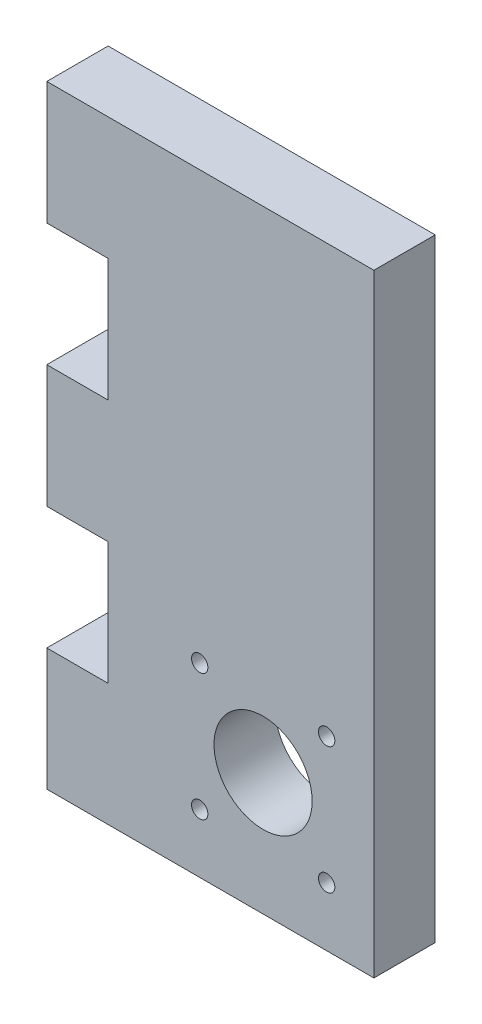
ISO-10303-21;
HEADER;
FILE_DESCRIPTION(('STEP AP214'),'2;1');
FILE_NAME('part.step','',(''),(''),'','','');
FILE_SCHEMA(('AUTOMOTIVE_DESIGN { 1 0 10303 214 1 1 1 1 }'));
ENDSEC;
DATA;
#1=APPLICATION_CONTEXT('core data for automotive mechanical design processes');
#2=APPLICATION_PROTOCOL_DEFINITION('international standard','automotive_design',2000,#1);
#3=PRODUCT_CONTEXT('',#1,'mechanical');
#4=PRODUCT('Part','Part','',(#3));
#5=PRODUCT_RELATED_PRODUCT_CATEGORY('part','',(#4));
#6=PRODUCT_DEFINITION_FORMATION('','',#4);
#7=PRODUCT_DEFINITION_CONTEXT('part definition',#1,'design');
#8=PRODUCT_DEFINITION('design','',#6,#7);
#9=PRODUCT_DEFINITION_SHAPE('','',#8);
#10=(LENGTH_UNIT() NAMED_UNIT(*) SI_UNIT(.MILLI.,.METRE.));
#11=(NAMED_UNIT(*) PLANE_ANGLE_UNIT() SI_UNIT($,.RADIAN.));
#12=(NAMED_UNIT(*) SI_UNIT($,.STERADIAN.) SOLID_ANGLE_UNIT());
#13=UNCERTAINTY_MEASURE_WITH_UNIT(LENGTH_MEASURE(1.E-05),#10,'distance_accuracy_value','');
#14=(GEOMETRIC_REPRESENTATION_CONTEXT(3) GLOBAL_UNCERTAINTY_ASSIGNED_CONTEXT((#13)) GLOBAL_UNIT_ASSIGNED_CONTEXT((#10,
#11,#12)) REPRESENTATION_CONTEXT('',''));
#15=CARTESIAN_POINT('',(0.,0.,0.));
#16=DIRECTION('',(0.,0.,1.));
#17=DIRECTION('',(1.,0.,0.));
#18=AXIS2_PLACEMENT_3D('',#15,#16,#17);
#19=CARTESIAN_POINT('',(0.,73.1047217518253,15.));
#20=DIRECTION('',(0.,1.,0.));
#21=DIRECTION('',(0.,0.,1.));
#22=AXIS2_PLACEMENT_3D('',#19,#20,#21);
#23=PLANE('',#22);
#24=DIRECTION('',(1.,0.,0.));
#25=VECTOR('',#24,1.);
#26=CARTESIAN_POINT('',(0.,73.1047217518253,0.));
#27=LINE('',#26,#25);
#28=CARTESIAN_POINT('',(-7.14707248897314,73.1047217518253,0.));
#29=VERTEX_POINT('',#28);
#30=CARTESIAN_POINT('',(72.8528442346072,73.1047217518253,0.));
#31=VERTEX_POINT('',#30);
#32=EDGE_CURVE('E172',#29,#31,#27,.T.);
#33=ORIENTED_EDGE('',*,*,#32,.F.);
#34=DIRECTION('',(0.,0.,-1.));
#35=VECTOR('',#34,1.);
#36=CARTESIAN_POINT('',(-7.14707248897314,73.1047217518253,15.));
#37=LINE('',#36,#35);
#38=CARTESIAN_POINT('',(-7.14707248897314,73.1047217518253,15.));
#39=VERTEX_POINT('',#38);
#40=EDGE_CURVE('E11',#39,#29,#37,.T.);
#41=ORIENTED_EDGE('',*,*,#40,.F.);
#42=DIRECTION('',(1.,0.,0.));
#43=VECTOR('',#42,1.);
#44=CARTESIAN_POINT('',(0.,73.1047217518253,15.));
#45=LINE('',#44,#43);
#46=CARTESIAN_POINT('',(72.8528442346072,73.1047217518253,15.));
#47=VERTEX_POINT('',#46);
#48=EDGE_CURVE('E448',#39,#47,#45,.T.);
#49=ORIENTED_EDGE('',*,*,#48,.T.);
#50=DIRECTION('',(0.,0.,-1.));
#51=VECTOR('',#50,1.);
#52=CARTESIAN_POINT('',(72.8528442346072,73.1047217518253,15.));
#53=LINE('',#52,#51);
#54=EDGE_CURVE('E98',#47,#31,#53,.T.);
#55=ORIENTED_EDGE('',*,*,#54,.T.);
#56=EDGE_LOOP('',(#33,#41,#49,#55));
#57=FACE_BOUND('',#56,.T.);
#58=ADVANCED_FACE('F34',(#57),#23,.T.);
#59=CARTESIAN_POINT('',(-7.15313922895416,0.000593622232566159,15.));
#60=DIRECTION('',(0.999999996556525,-8.29876522071872E-05,0.));
#61=DIRECTION('',(8.29876522071872E-05,0.999999996556525,0.));
#62=AXIS2_PLACEMENT_3D('',#59,#60,#61);
#63=PLANE('',#62);
#64=DIRECTION('',(-8.29876522071872E-05,-0.999999996556525,0.));
#65=VECTOR('',#64,1.);
#66=CARTESIAN_POINT('',(-7.15313922895416,0.000593622232566159,0.));
#67=LINE('',#66,#65);
#68=CARTESIAN_POINT('',(-7.14956211853936,43.1047218551295,0.));
#69=VERTEX_POINT('',#68);
#70=EDGE_CURVE('E174',#29,#69,#67,.T.);
#71=ORIENTED_EDGE('',*,*,#70,.T.);
#72=DIRECTION('',(0.,0.,-1.));
#73=VECTOR('',#72,1.);
#74=CARTESIAN_POINT('',(-7.14956211853936,43.1047218551295,15.));
#75=LINE('',#74,#73);
#76=CARTESIAN_POINT('',(-7.14956211853936,43.1047218551295,15.));
#77=VERTEX_POINT('',#76);
#78=EDGE_CURVE('E43',#77,#69,#75,.T.);
#79=ORIENTED_EDGE('',*,*,#78,.F.);
#80=DIRECTION('',(-8.29876522071872E-05,-0.999999996556525,0.));
#81=VECTOR('',#80,1.);
#82=CARTESIAN_POINT('',(-7.15313922895416,0.000593622232566159,15.));
#83=LINE('',#82,#81);
#84=EDGE_CURVE('E446',#39,#77,#83,.T.);
#85=ORIENTED_EDGE('',*,*,#84,.F.);
#86=ORIENTED_EDGE('',*,*,#40,.T.);
#87=EDGE_LOOP('',(#71,#79,#85,#86));
#88=FACE_BOUND('',#87,.T.);
#89=ADVANCED_FACE('F226',(#88),#63,.F.);
#90=CARTESIAN_POINT('',(0.,43.1047218551295,15.));
#91=DIRECTION('',(0.,1.,0.));
#92=DIRECTION('',(-1.,0.,0.));
#93=AXIS2_PLACEMENT_3D('',#90,#91,#92);
#94=PLANE('',#93);
#95=DIRECTION('',(1.,0.,0.));
#96=VECTOR('',#95,1.);
#97=CARTESIAN_POINT('',(0.,43.1047218551295,0.));
#98=LINE('',#97,#96);
#99=CARTESIAN_POINT('',(7.85043788146065,43.1047218551295,0.));
#100=VERTEX_POINT('',#99);
#101=EDGE_CURVE('E177',#69,#100,#98,.T.);
#102=ORIENTED_EDGE('',*,*,#101,.T.);
#103=DIRECTION('',(0.,0.,-1.));
#104=VECTOR('',#103,1.);
#105=CARTESIAN_POINT('',(7.85043788146065,43.1047218551295,15.));
#106=LINE('',#105,#104);
#107=CARTESIAN_POINT('',(7.85043788146065,43.1047218551295,15.));
#108=VERTEX_POINT('',#107);
#109=EDGE_CURVE('E216',#108,#100,#106,.T.);
#110=ORIENTED_EDGE('',*,*,#109,.F.);
#111=DIRECTION('',(1.,0.,0.));
#112=VECTOR('',#111,1.);
#113=CARTESIAN_POINT('',(0.,43.1047218551295,15.));
#114=LINE('',#113,#112);
#115=EDGE_CURVE('E222',#77,#108,#114,.T.);
#116=ORIENTED_EDGE('',*,*,#115,.F.);
#117=ORIENTED_EDGE('',*,*,#78,.T.);
#118=EDGE_LOOP('',(#102,#110,#116,#117));
#119=FACE_BOUND('',#118,.T.);
#120=ADVANCED_FACE('F220',(#119),#94,.F.);
#121=CARTESIAN_POINT('',(7.85043788146065,0.,15.));
#122=DIRECTION('',(-1.,0.,0.));
#123=DIRECTION('',(0.,0.,1.));
#124=AXIS2_PLACEMENT_3D('',#121,#122,#123);
#125=PLANE('',#124);
#126=DIRECTION('',(0.,1.,0.));
#127=VECTOR('',#126,1.);
#128=CARTESIAN_POINT('',(7.85043788146065,0.,0.));
#129=LINE('',#128,#127);
#130=CARTESIAN_POINT('',(7.85043788146065,13.1047218551295,0.));
#131=VERTEX_POINT('',#130);
#132=EDGE_CURVE('E180',#131,#100,#129,.T.);
#133=ORIENTED_EDGE('',*,*,#132,.F.);
#134=DIRECTION('',(0.,0.,-1.));
#135=VECTOR('',#134,1.);
#136=CARTESIAN_POINT('',(7.85043788146065,13.1047218551295,15.));
#137=LINE('',#136,#135);
#138=CARTESIAN_POINT('',(7.85043788146065,13.1047218551295,15.));
#139=VERTEX_POINT('',#138);
#140=EDGE_CURVE('E214',#139,#131,#137,.T.);
#141=ORIENTED_EDGE('',*,*,#140,.F.);
#142=DIRECTION('',(0.,1.,0.));
#143=VECTOR('',#142,1.);
#144=CARTESIAN_POINT('',(7.85043788146065,0.,15.));
#145=LINE('',#144,#143);
#146=EDGE_CURVE('E433',#139,#108,#145,.T.);
#147=ORIENTED_EDGE('',*,*,#146,.T.);
#148=ORIENTED_EDGE('',*,*,#109,.T.);
#149=EDGE_LOOP('',(#133,#141,#147,#148));
#150=FACE_BOUND('',#149,.T.);
#151=ADVANCED_FACE('F305',(#150),#125,.T.);
#152=CARTESIAN_POINT('',(0.,13.1047218551295,15.));
#153=DIRECTION('',(0.,1.,0.));
#154=DIRECTION('',(0.,0.,1.));
#155=AXIS2_PLACEMENT_3D('',#152,#153,#154);
#156=PLANE('',#155);
#157=DIRECTION('',(1.,0.,0.));
#158=VECTOR('',#157,1.);
#159=CARTESIAN_POINT('',(0.,13.1047218551295,0.));
#160=LINE('',#159,#158);
#161=CARTESIAN_POINT('',(-7.14715576539281,13.1047218551295,0.));
#162=VERTEX_POINT('',#161);
#163=EDGE_CURVE('E183',#162,#131,#160,.T.);
#164=ORIENTED_EDGE('',*,*,#163,.F.);
#165=DIRECTION('',(0.,0.,-1.));
#166=VECTOR('',#165,1.);
#167=CARTESIAN_POINT('',(-7.14715576539281,13.1047218551295,15.));
#168=LINE('',#167,#166);
#169=CARTESIAN_POINT('',(-7.14715576539281,13.1047218551295,15.));
#170=VERTEX_POINT('',#169);
#171=EDGE_CURVE('E212',#170,#162,#168,.T.);
#172=ORIENTED_EDGE('',*,*,#171,.F.);
#173=DIRECTION('',(1.,0.,0.));
#174=VECTOR('',#173,1.);
#175=CARTESIAN_POINT('',(0.,13.1047218551295,15.));
#176=LINE('',#175,#174);
#177=EDGE_CURVE('E429',#170,#139,#176,.T.);
#178=ORIENTED_EDGE('',*,*,#177,.T.);
#179=ORIENTED_EDGE('',*,*,#140,.T.);
#180=EDGE_LOOP('',(#164,#172,#178,#179));
#181=FACE_BOUND('',#180,.T.);
#182=ADVANCED_FACE('F301',(#181),#156,.T.);
#183=CARTESIAN_POINT('',(-7.14715576539281,0.,15.));
#184=DIRECTION('',(-1.,0.,0.));
#185=DIRECTION('',(0.,0.,1.));
#186=AXIS2_PLACEMENT_3D('',#183,#184,#185);
#187=PLANE('',#186);
#188=DIRECTION('',(0.,1.,0.));
#189=VECTOR('',#188,1.);
#190=CARTESIAN_POINT('',(-7.14715576539281,0.,0.));
#191=LINE('',#190,#189);
#192=CARTESIAN_POINT('',(-7.14715576539281,-16.8952780483616,0.));
#193=VERTEX_POINT('',#192);
#194=EDGE_CURVE('E186',#193,#162,#191,.T.);
#195=ORIENTED_EDGE('',*,*,#194,.F.);
#196=DIRECTION('',(0.,0.,-1.));
#197=VECTOR('',#196,1.);
#198=CARTESIAN_POINT('',(-7.14715576539281,-16.8952780483616,15.));
#199=LINE('',#198,#197);
#200=CARTESIAN_POINT('',(-7.14715576539281,-16.8952780483616,15.));
#201=VERTEX_POINT('',#200);
#202=EDGE_CURVE('E210',#201,#193,#199,.T.);
#203=ORIENTED_EDGE('',*,*,#202,.F.);
#204=DIRECTION('',(0.,1.,0.));
#205=VECTOR('',#204,1.);
#206=CARTESIAN_POINT('',(-7.14715576539281,0.,15.));
#207=LINE('',#206,#205);
#208=EDGE_CURVE('E432',#201,#170,#207,.T.);
#209=ORIENTED_EDGE('',*,*,#208,.T.);
#210=ORIENTED_EDGE('',*,*,#171,.T.);
#211=EDGE_LOOP('',(#195,#203,#209,#210));
#212=FACE_BOUND('',#211,.T.);
#213=ADVANCED_FACE('F297',(#212),#187,.T.);
#214=CARTESIAN_POINT('',(0.,-16.8952780483616,15.));
#215=DIRECTION('',(0.,1.,0.));
#216=DIRECTION('',(-1.,0.,0.));
#217=AXIS2_PLACEMENT_3D('',#214,#215,#216);
#218=PLANE('',#217);
#219=DIRECTION('',(1.,0.,0.));
#220=VECTOR('',#219,1.);
#221=CARTESIAN_POINT('',(0.,-16.8952780483616,0.));
#222=LINE('',#221,#220);
#223=CARTESIAN_POINT('',(7.85284423460719,-16.8952780483616,0.));
#224=VERTEX_POINT('',#223);
#225=EDGE_CURVE('E189',#193,#224,#222,.T.);
#226=ORIENTED_EDGE('',*,*,#225,.T.);
#227=DIRECTION('',(0.,0.,-1.));
#228=VECTOR('',#227,1.);
#229=CARTESIAN_POINT('',(7.85284423460719,-16.8952780483616,15.));
#230=LINE('',#229,#228);
#231=CARTESIAN_POINT('',(7.85284423460719,-16.8952780483616,15.));
#232=VERTEX_POINT('',#231);
#233=EDGE_CURVE('E208',#232,#224,#230,.T.);
#234=ORIENTED_EDGE('',*,*,#233,.F.);
#235=DIRECTION('',(1.,0.,0.));
#236=VECTOR('',#235,1.);
#237=CARTESIAN_POINT('',(0.,-16.8952780483616,15.));
#238=LINE('',#237,#236);
#239=EDGE_CURVE('E435',#201,#232,#238,.T.);
#240=ORIENTED_EDGE('',*,*,#239,.F.);
#241=ORIENTED_EDGE('',*,*,#202,.T.);
#242=EDGE_LOOP('',(#226,#234,#240,#241));
#243=FACE_BOUND('',#242,.T.);
#244=ADVANCED_FACE('F293',(#243),#218,.F.);
#245=CARTESIAN_POINT('',(7.85284423460719,0.,15.));
#246=DIRECTION('',(-1.,0.,0.));
#247=DIRECTION('',(0.,0.,1.));
#248=AXIS2_PLACEMENT_3D('',#245,#246,#247);
#249=PLANE('',#248);
#250=DIRECTION('',(0.,1.,0.));
#251=VECTOR('',#250,1.);
#252=CARTESIAN_POINT('',(7.85284423460719,0.,0.));
#253=LINE('',#252,#251);
#254=CARTESIAN_POINT('',(7.85284423460719,-46.8952780483616,0.));
#255=VERTEX_POINT('',#254);
#256=EDGE_CURVE('E192',#255,#224,#253,.T.);
#257=ORIENTED_EDGE('',*,*,#256,.F.);
#258=DIRECTION('',(0.,0.,-1.));
#259=VECTOR('',#258,1.);
#260=CARTESIAN_POINT('',(7.85284423460719,-46.8952780483616,15.));
#261=LINE('',#260,#259);
#262=CARTESIAN_POINT('',(7.85284423460719,-46.8952780483616,15.));
#263=VERTEX_POINT('',#262);
#264=EDGE_CURVE('E206',#263,#255,#261,.T.);
#265=ORIENTED_EDGE('',*,*,#264,.F.);
#266=DIRECTION('',(0.,1.,0.));
#267=VECTOR('',#266,1.);
#268=CARTESIAN_POINT('',(7.85284423460719,0.,15.));
#269=LINE('',#268,#267);
#270=EDGE_CURVE('E152',#263,#232,#269,.T.);
#271=ORIENTED_EDGE('',*,*,#270,.T.);
#272=ORIENTED_EDGE('',*,*,#233,.T.);
#273=EDGE_LOOP('',(#257,#265,#271,#272));
#274=FACE_BOUND('',#273,.T.);
#275=ADVANCED_FACE('F289',(#274),#249,.T.);
#276=CARTESIAN_POINT('',(0.,-46.8952780483616,15.));
#277=DIRECTION('',(0.,1.,0.));
#278=DIRECTION('',(0.,0.,1.));
#279=AXIS2_PLACEMENT_3D('',#276,#277,#278);
#280=PLANE('',#279);
#281=DIRECTION('',(1.,0.,0.));
#282=VECTOR('',#281,1.);
#283=CARTESIAN_POINT('',(0.,-46.8952780483616,0.));
#284=LINE('',#283,#282);
#285=CARTESIAN_POINT('',(-7.14715576539281,-46.8952780483616,0.));
#286=VERTEX_POINT('',#285);
#287=EDGE_CURVE('E195',#286,#255,#284,.T.);
#288=ORIENTED_EDGE('',*,*,#287,.F.);
#289=DIRECTION('',(0.,0.,-1.));
#290=VECTOR('',#289,1.);
#291=CARTESIAN_POINT('',(-7.14715576539281,-46.8952780483616,15.));
#292=LINE('',#291,#290);
#293=CARTESIAN_POINT('',(-7.14715576539281,-46.8952780483616,15.));
#294=VERTEX_POINT('',#293);
#295=EDGE_CURVE('E139',#294,#286,#292,.T.);
#296=ORIENTED_EDGE('',*,*,#295,.F.);
#297=DIRECTION('',(1.,0.,0.));
#298=VECTOR('',#297,1.);
#299=CARTESIAN_POINT('',(0.,-46.8952780483616,15.));
#300=LINE('',#299,#298);
#301=EDGE_CURVE('E150',#294,#263,#300,.T.);
#302=ORIENTED_EDGE('',*,*,#301,.T.);
#303=ORIENTED_EDGE('',*,*,#264,.T.);
#304=EDGE_LOOP('',(#288,#296,#302,#303));
#305=FACE_BOUND('',#304,.T.);
#306=ADVANCED_FACE('F286',(#305),#280,.T.);
#307=CARTESIAN_POINT('',(-7.14715576539281,0.,15.));
#308=DIRECTION('',(-1.,0.,0.));
#309=DIRECTION('',(0.,0.,1.));
#310=AXIS2_PLACEMENT_3D('',#307,#308,#309);
#311=PLANE('',#310);
#312=DIRECTION('',(0.,1.,0.));
#313=VECTOR('',#312,1.);
#314=CARTESIAN_POINT('',(-7.14715576539281,0.,0.));
#315=LINE('',#314,#313);
#316=CARTESIAN_POINT('',(-7.14715576539281,-76.8066400915339,0.));
#317=VERTEX_POINT('',#316);
#318=EDGE_CURVE('E136',#317,#286,#315,.T.);
#319=ORIENTED_EDGE('',*,*,#318,.F.);
#320=DIRECTION('',(0.,0.,-1.));
#321=VECTOR('',#320,1.);
#322=CARTESIAN_POINT('',(-7.14715576539281,-76.8066400915339,15.));
#323=LINE('',#322,#321);
#324=CARTESIAN_POINT('',(-7.14715576539281,-76.8066400915339,15.));
#325=VERTEX_POINT('',#324);
#326=EDGE_CURVE('E130',#325,#317,#323,.T.);
#327=ORIENTED_EDGE('',*,*,#326,.F.);
#328=DIRECTION('',(0.,1.,0.));
#329=VECTOR('',#328,1.);
#330=CARTESIAN_POINT('',(-7.14715576539281,0.,15.));
#331=LINE('',#330,#329);
#332=EDGE_CURVE('E134',#325,#294,#331,.T.);
#333=ORIENTED_EDGE('',*,*,#332,.T.);
#334=ORIENTED_EDGE('',*,*,#295,.T.);
#335=EDGE_LOOP('',(#319,#327,#333,#334));
#336=FACE_BOUND('',#335,.T.);
#337=ADVANCED_FACE('F132',(#336),#311,.T.);
#338=CARTESIAN_POINT('',(0.,-76.8066400915339,15.));
#339=DIRECTION('',(0.,1.,0.));
#340=DIRECTION('',(0.,0.,1.));
#341=AXIS2_PLACEMENT_3D('',#338,#339,#340);
#342=PLANE('',#341);
#343=DIRECTION('',(1.,0.,0.));
#344=VECTOR('',#343,1.);
#345=CARTESIAN_POINT('',(0.,-76.8066400915339,0.));
#346=LINE('',#345,#344);
#347=CARTESIAN_POINT('',(72.8528442346072,-76.8066400915339,0.));
#348=VERTEX_POINT('',#347);
#349=EDGE_CURVE('E199',#317,#348,#346,.T.);
#350=ORIENTED_EDGE('',*,*,#349,.T.);
#351=DIRECTION('',(0.,0.,-1.));
#352=VECTOR('',#351,1.);
#353=CARTESIAN_POINT('',(72.8528442346072,-76.8066400915339,15.));
#354=LINE('',#353,#352);
#355=CARTESIAN_POINT('',(72.8528442346072,-76.8066400915339,15.));
#356=VERTEX_POINT('',#355);
#357=EDGE_CURVE('E140',#356,#348,#354,.T.);
#358=ORIENTED_EDGE('',*,*,#357,.F.);
#359=DIRECTION('',(1.,0.,0.));
#360=VECTOR('',#359,1.);
#361=CARTESIAN_POINT('',(0.,-76.8066400915339,15.));
#362=LINE('',#361,#360);
#363=EDGE_CURVE('E143',#325,#356,#362,.T.);
#364=ORIENTED_EDGE('',*,*,#363,.F.);
#365=ORIENTED_EDGE('',*,*,#326,.T.);
#366=EDGE_LOOP('',(#350,#358,#364,#365));
#367=FACE_BOUND('',#366,.T.);
#368=ADVANCED_FACE('F144',(#367),#342,.F.);
#369=CARTESIAN_POINT('',(61.3,-31.3820767716705,15.));
#370=DIRECTION('',(0.,0.,-1.));
#371=DIRECTION('',(-1.,0.,0.));
#372=AXIS2_PLACEMENT_3D('',#369,#370,#371);
#373=CYLINDRICAL_SURFACE('',#372,1.99999999999999);
#374=CARTESIAN_POINT('',(61.3,-31.3820767716705,15.));
#375=DIRECTION('',(0.,0.,1.));
#376=DIRECTION('',(1.,0.,0.));
#377=AXIS2_PLACEMENT_3D('',#374,#375,#376);
#378=CIRCLE('',#377,1.99999999999999);
#379=CARTESIAN_POINT('',(63.3,-31.3820767716705,15.));
#380=VERTEX_POINT('',#379);
#381=EDGE_CURVE('E450',#380,#380,#378,.T.);
#382=ORIENTED_EDGE('',*,*,#381,.T.);
#383=EDGE_LOOP('',(#382));
#384=FACE_BOUND('',#383,.T.);
#385=CARTESIAN_POINT('',(61.3,-31.3820767716705,0.));
#386=DIRECTION('',(0.,0.,1.));
#387=DIRECTION('',(1.,0.,0.));
#388=AXIS2_PLACEMENT_3D('',#385,#386,#387);
#389=CIRCLE('',#388,1.99999999999999);
#390=CARTESIAN_POINT('',(63.3,-31.3820767716705,0.));
#391=VERTEX_POINT('',#390);
#392=EDGE_CURVE('E169',#391,#391,#389,.T.);
#393=ORIENTED_EDGE('',*,*,#392,.F.);
#394=EDGE_LOOP('',(#393));
#395=FACE_BOUND('',#394,.T.);
#396=ADVANCED_FACE('F236',(#384,#395),#373,.F.);
#397=CARTESIAN_POINT('',(61.3,-62.4,15.));
#398=DIRECTION('',(0.,0.,-1.));
#399=DIRECTION('',(-1.,0.,0.));
#400=AXIS2_PLACEMENT_3D('',#397,#398,#399);
#401=CYLINDRICAL_SURFACE('',#400,2.);
#402=CARTESIAN_POINT('',(61.3,-62.4,15.));
#403=DIRECTION('',(0.,0.,1.));
#404=DIRECTION('',(1.,0.,0.));
#405=AXIS2_PLACEMENT_3D('',#402,#403,#404);
#406=CIRCLE('',#405,2.);
#407=CARTESIAN_POINT('',(63.3,-62.4,15.));
#408=VERTEX_POINT('',#407);
#409=EDGE_CURVE('E453',#408,#408,#406,.T.);
#410=ORIENTED_EDGE('',*,*,#409,.T.);
#411=EDGE_LOOP('',(#410));
#412=FACE_BOUND('',#411,.T.);
#413=CARTESIAN_POINT('',(61.3,-62.4,0.));
#414=DIRECTION('',(0.,0.,1.));
#415=DIRECTION('',(1.,0.,0.));
#416=AXIS2_PLACEMENT_3D('',#413,#414,#415);
#417=CIRCLE('',#416,2.);
#418=CARTESIAN_POINT('',(63.3,-62.4,0.));
#419=VERTEX_POINT('',#418);
#420=EDGE_CURVE('E166',#419,#419,#417,.T.);
#421=ORIENTED_EDGE('',*,*,#420,.F.);
#422=EDGE_LOOP('',(#421));
#423=FACE_BOUND('',#422,.T.);
#424=ADVANCED_FACE('F239',(#412,#423),#401,.F.);
#425=CARTESIAN_POINT('',(30.2518158594184,-62.4,15.));
#426=DIRECTION('',(0.,0.,-1.));
#427=DIRECTION('',(-1.,0.,0.));
#428=AXIS2_PLACEMENT_3D('',#425,#426,#427);
#429=CYLINDRICAL_SURFACE('',#428,2.);
#430=CARTESIAN_POINT('',(30.2518158594184,-62.4,15.));
#431=DIRECTION('',(0.,0.,1.));
#432=DIRECTION('',(1.,0.,0.));
#433=AXIS2_PLACEMENT_3D('',#430,#431,#432);
#434=CIRCLE('',#433,2.);
#435=CARTESIAN_POINT('',(32.2518158594184,-62.4,15.));
#436=VERTEX_POINT('',#435);
#437=EDGE_CURVE('E456',#436,#436,#434,.T.);
#438=ORIENTED_EDGE('',*,*,#437,.T.);
#439=EDGE_LOOP('',(#438));
#440=FACE_BOUND('',#439,.T.);
#441=CARTESIAN_POINT('',(30.2518158594184,-62.4,0.));
#442=DIRECTION('',(0.,0.,1.));
#443=DIRECTION('',(1.,0.,0.));
#444=AXIS2_PLACEMENT_3D('',#441,#442,#443);
#445=CIRCLE('',#444,2.);
#446=CARTESIAN_POINT('',(32.2518158594184,-62.4,0.));
#447=VERTEX_POINT('',#446);
#448=EDGE_CURVE('E163',#447,#447,#445,.T.);
#449=ORIENTED_EDGE('',*,*,#448,.F.);
#450=EDGE_LOOP('',(#449));
#451=FACE_BOUND('',#450,.T.);
#452=ADVANCED_FACE('F243',(#440,#451),#429,.F.);
#453=CARTESIAN_POINT('',(30.2518158594184,-31.3820767716705,15.));
#454=DIRECTION('',(0.,0.,-1.));
#455=DIRECTION('',(-1.,0.,0.));
#456=AXIS2_PLACEMENT_3D('',#453,#454,#455);
#457=CYLINDRICAL_SURFACE('',#456,2.);
#458=CARTESIAN_POINT('',(30.2518158594184,-31.3820767716705,15.));
#459=DIRECTION('',(0.,0.,1.));
#460=DIRECTION('',(1.,0.,0.));
#461=AXIS2_PLACEMENT_3D('',#458,#459,#460);
#462=CIRCLE('',#461,2.);
#463=CARTESIAN_POINT('',(32.2518158594184,-31.3820767716705,15.));
#464=VERTEX_POINT('',#463);
#465=EDGE_CURVE('E258',#464,#464,#462,.T.);
#466=ORIENTED_EDGE('',*,*,#465,.T.);
#467=EDGE_LOOP('',(#466));
#468=FACE_BOUND('',#467,.T.);
#469=CARTESIAN_POINT('',(30.2518158594184,-31.3820767716705,0.));
#470=DIRECTION('',(0.,0.,1.));
#471=DIRECTION('',(1.,0.,0.));
#472=AXIS2_PLACEMENT_3D('',#469,#470,#471);
#473=CIRCLE('',#472,2.);
#474=CARTESIAN_POINT('',(32.2518158594184,-31.3820767716705,0.));
#475=VERTEX_POINT('',#474);
#476=EDGE_CURVE('E160',#475,#475,#473,.T.);
#477=ORIENTED_EDGE('',*,*,#476,.F.);
#478=EDGE_LOOP('',(#477));
#479=FACE_BOUND('',#478,.T.);
#480=ADVANCED_FACE('F246',(#468,#479),#457,.F.);
#481=CARTESIAN_POINT('',(45.7502162801631,-46.8952780483616,15.));
#482=DIRECTION('',(0.,0.,-1.));
#483=DIRECTION('',(-1.,0.,0.));
#484=AXIS2_PLACEMENT_3D('',#481,#482,#483);
#485=CYLINDRICAL_SURFACE('',#484,12.003896258436);
#486=CARTESIAN_POINT('',(45.7502162801631,-46.8952780483616,15.));
#487=DIRECTION('',(0.,0.,1.));
#488=DIRECTION('',(1.,0.,0.));
#489=AXIS2_PLACEMENT_3D('',#486,#487,#488);
#490=CIRCLE('',#489,12.003896258436);
#491=CARTESIAN_POINT('',(57.7541125385991,-46.8952780483616,15.));
#492=VERTEX_POINT('',#491);
#493=EDGE_CURVE('E202',#492,#492,#490,.T.);
#494=ORIENTED_EDGE('',*,*,#493,.T.);
#495=EDGE_LOOP('',(#494));
#496=FACE_BOUND('',#495,.T.);
#497=CARTESIAN_POINT('',(45.7502162801631,-46.8952780483616,0.));
#498=DIRECTION('',(0.,0.,1.));
#499=DIRECTION('',(1.,0.,0.));
#500=AXIS2_PLACEMENT_3D('',#497,#498,#499);
#501=CIRCLE('',#500,12.003896258436);
#502=CARTESIAN_POINT('',(57.7541125385991,-46.8952780483616,0.));
#503=VERTEX_POINT('',#502);
#504=EDGE_CURVE('E157',#503,#503,#501,.T.);
#505=ORIENTED_EDGE('',*,*,#504,.F.);
#506=EDGE_LOOP('',(#505));
#507=FACE_BOUND('',#506,.T.);
#508=ADVANCED_FACE('F36',(#496,#507),#485,.F.);
#509=CARTESIAN_POINT('',(72.8528442346072,0.,15.));
#510=DIRECTION('',(-1.,0.,0.));
#511=DIRECTION('',(0.,0.,1.));
#512=AXIS2_PLACEMENT_3D('',#509,#510,#511);
#513=PLANE('',#512);
#514=DIRECTION('',(0.,1.,0.));
#515=VECTOR('',#514,1.);
#516=CARTESIAN_POINT('',(72.8528442346072,0.,0.));
#517=LINE('',#516,#515);
#518=EDGE_CURVE('E91',#348,#31,#517,.T.);
#519=ORIENTED_EDGE('',*,*,#518,.T.);
#520=ORIENTED_EDGE('',*,*,#54,.F.);
#521=DIRECTION('',(0.,1.,0.));
#522=VECTOR('',#521,1.);
#523=CARTESIAN_POINT('',(72.8528442346072,0.,15.));
#524=LINE('',#523,#522);
#525=EDGE_CURVE('E51',#356,#47,#524,.T.);
#526=ORIENTED_EDGE('',*,*,#525,.F.);
#527=ORIENTED_EDGE('',*,*,#357,.T.);
#528=EDGE_LOOP('',(#519,#520,#526,#527));
#529=FACE_BOUND('',#528,.T.);
#530=ADVANCED_FACE('F253',(#529),#513,.F.);
#531=CARTESIAN_POINT('',(0.,0.,15.));
#532=DIRECTION('',(0.,0.,1.));
#533=DIRECTION('',(1.,0.,0.));
#534=AXIS2_PLACEMENT_3D('',#531,#532,#533);
#535=PLANE('',#534);
#536=ORIENTED_EDGE('',*,*,#493,.F.);
#537=EDGE_LOOP('',(#536));
#538=FACE_BOUND('',#537,.T.);
#539=ORIENTED_EDGE('',*,*,#465,.F.);
#540=EDGE_LOOP('',(#539));
#541=FACE_BOUND('',#540,.T.);
#542=ORIENTED_EDGE('',*,*,#437,.F.);
#543=EDGE_LOOP('',(#542));
#544=FACE_BOUND('',#543,.T.);
#545=ORIENTED_EDGE('',*,*,#409,.F.);
#546=EDGE_LOOP('',(#545));
#547=FACE_BOUND('',#546,.T.);
#548=ORIENTED_EDGE('',*,*,#381,.F.);
#549=EDGE_LOOP('',(#548));
#550=FACE_BOUND('',#549,.T.);
#551=ORIENTED_EDGE('',*,*,#48,.F.);
#552=ORIENTED_EDGE('',*,*,#84,.T.);
#553=ORIENTED_EDGE('',*,*,#115,.T.);
#554=ORIENTED_EDGE('',*,*,#146,.F.);
#555=ORIENTED_EDGE('',*,*,#177,.F.);
#556=ORIENTED_EDGE('',*,*,#208,.F.);
#557=ORIENTED_EDGE('',*,*,#239,.T.);
#558=ORIENTED_EDGE('',*,*,#270,.F.);
#559=ORIENTED_EDGE('',*,*,#301,.F.);
#560=ORIENTED_EDGE('',*,*,#332,.F.);
#561=ORIENTED_EDGE('',*,*,#363,.T.);
#562=ORIENTED_EDGE('',*,*,#525,.T.);
#563=EDGE_LOOP('',(#551,#552,#553,#554,#555,#556,#557,#558,#559,#560,#561,#562));
#564=FACE_BOUND('',#563,.T.);
#565=ADVANCED_FACE('F147',(#538,#541,#544,#547,#550,#564),#535,.T.);
#566=CARTESIAN_POINT('',(0.,0.,0.));
#567=DIRECTION('',(0.,0.,1.));
#568=DIRECTION('',(1.,0.,0.));
#569=AXIS2_PLACEMENT_3D('',#566,#567,#568);
#570=PLANE('',#569);
#571=ORIENTED_EDGE('',*,*,#504,.T.);
#572=EDGE_LOOP('',(#571));
#573=FACE_BOUND('',#572,.T.);
#574=ORIENTED_EDGE('',*,*,#476,.T.);
#575=EDGE_LOOP('',(#574));
#576=FACE_BOUND('',#575,.T.);
#577=ORIENTED_EDGE('',*,*,#448,.T.);
#578=EDGE_LOOP('',(#577));
#579=FACE_BOUND('',#578,.T.);
#580=ORIENTED_EDGE('',*,*,#420,.T.);
#581=EDGE_LOOP('',(#580));
#582=FACE_BOUND('',#581,.T.);
#583=ORIENTED_EDGE('',*,*,#392,.T.);
#584=EDGE_LOOP('',(#583));
#585=FACE_BOUND('',#584,.T.);
#586=ORIENTED_EDGE('',*,*,#32,.T.);
#587=ORIENTED_EDGE('',*,*,#518,.F.);
#588=ORIENTED_EDGE('',*,*,#349,.F.);
#589=ORIENTED_EDGE('',*,*,#318,.T.);
#590=ORIENTED_EDGE('',*,*,#287,.T.);
#591=ORIENTED_EDGE('',*,*,#256,.T.);
#592=ORIENTED_EDGE('',*,*,#225,.F.);
#593=ORIENTED_EDGE('',*,*,#194,.T.);
#594=ORIENTED_EDGE('',*,*,#163,.T.);
#595=ORIENTED_EDGE('',*,*,#132,.T.);
#596=ORIENTED_EDGE('',*,*,#101,.F.);
#597=ORIENTED_EDGE('',*,*,#70,.F.);
#598=EDGE_LOOP('',(#586,#587,#588,#589,#590,#591,#592,#593,#594,#595,#596,#597));
#599=FACE_BOUND('',#598,.T.);
#600=ADVANCED_FACE('F227',(#573,#576,#579,#582,#585,#599),#570,.F.);
#601=CLOSED_SHELL('',(#58,#89,#120,#151,#182,#213,#244,#275,#306,#337,#368,#396,#424,#452,#480,
#508,#530,#565,#600));
#602=MANIFOLD_SOLID_BREP('B2',#601);
#603=ADVANCED_BREP_SHAPE_REPRESENTATION('',(#18,#602),#14);
#604=SHAPE_DEFINITION_REPRESENTATION(#9,#603);
ENDSEC;
END-ISO-10303-21;
